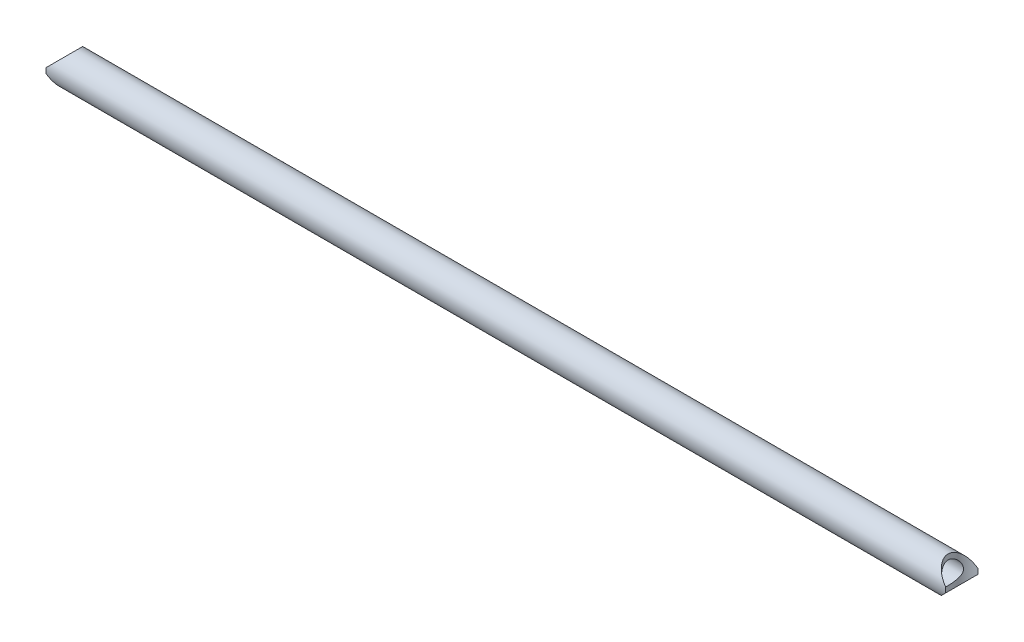
ISO-10303-21;
HEADER;
FILE_DESCRIPTION(('STEP AP214'),'2;1');
FILE_NAME('part.step','',(''),(''),'','','');
FILE_SCHEMA(('AUTOMOTIVE_DESIGN { 1 0 10303 214 1 1 1 1 }'));
ENDSEC;
DATA;
#1=APPLICATION_CONTEXT('core data for automotive mechanical design processes');
#2=APPLICATION_PROTOCOL_DEFINITION('international standard','automotive_design',2000,#1);
#3=PRODUCT_CONTEXT('',#1,'mechanical');
#4=PRODUCT('Part','Part','',(#3));
#5=PRODUCT_RELATED_PRODUCT_CATEGORY('part','',(#4));
#6=PRODUCT_DEFINITION_FORMATION('','',#4);
#7=PRODUCT_DEFINITION_CONTEXT('part definition',#1,'design');
#8=PRODUCT_DEFINITION('design','',#6,#7);
#9=PRODUCT_DEFINITION_SHAPE('','',#8);
#10=(LENGTH_UNIT() NAMED_UNIT(*) SI_UNIT(.MILLI.,.METRE.));
#11=(NAMED_UNIT(*) PLANE_ANGLE_UNIT() SI_UNIT($,.RADIAN.));
#12=(NAMED_UNIT(*) SI_UNIT($,.STERADIAN.) SOLID_ANGLE_UNIT());
#13=UNCERTAINTY_MEASURE_WITH_UNIT(LENGTH_MEASURE(1.E-05),#10,'distance_accuracy_value','');
#14=(GEOMETRIC_REPRESENTATION_CONTEXT(3) GLOBAL_UNCERTAINTY_ASSIGNED_CONTEXT((#13)) GLOBAL_UNIT_ASSIGNED_CONTEXT((#10,
#11,#12)) REPRESENTATION_CONTEXT('',''));
#15=CARTESIAN_POINT('',(0.,0.,0.));
#16=DIRECTION('',(0.,0.,1.));
#17=DIRECTION('',(1.,0.,0.));
#18=AXIS2_PLACEMENT_3D('',#15,#16,#17);
#19=CARTESIAN_POINT('',(261.9375,0.,0.));
#20=DIRECTION('',(1.,0.,0.));
#21=DIRECTION('',(0.,0.,-1.));
#22=AXIS2_PLACEMENT_3D('',#19,#20,#21);
#23=PLANE('',#22);
#24=CARTESIAN_POINT('',(261.9375,0.,0.));
#25=DIRECTION('',(1.,0.,0.));
#26=DIRECTION('',(0.,0.,-1.));
#27=AXIS2_PLACEMENT_3D('',#24,#25,#26);
#28=CIRCLE('',#27,9.525);
#29=CARTESIAN_POINT('',(261.9375,-1.58750000000008,9.39177665567063));
#30=VERTEX_POINT('',#29);
#31=CARTESIAN_POINT('',(261.9375,1.58750000000008,9.39177665567063));
#32=VERTEX_POINT('',#31);
#33=EDGE_CURVE('E68',#30,#32,#28,.F.);
#34=ORIENTED_EDGE('',*,*,#33,.F.);
#35=DIRECTION('',(0.,1.,0.));
#36=VECTOR('',#35,1.);
#37=CARTESIAN_POINT('',(261.9375,-65.5701,9.39177665567062));
#38=LINE('',#37,#36);
#39=EDGE_CURVE('E73',#30,#32,#38,.T.);
#40=ORIENTED_EDGE('',*,*,#39,.T.);
#41=EDGE_LOOP('',(#34,#40));
#42=FACE_BOUND('',#41,.T.);
#43=ADVANCED_FACE('F17',(#42),#23,.T.);
#44=CARTESIAN_POINT('',(-261.9375,0.,0.));
#45=DIRECTION('',(1.,0.,0.));
#46=DIRECTION('',(0.,0.,-1.));
#47=AXIS2_PLACEMENT_3D('',#44,#45,#46);
#48=PLANE('',#47);
#49=DIRECTION('',(0.,1.,0.));
#50=VECTOR('',#49,1.);
#51=CARTESIAN_POINT('',(-261.9375,-65.5701,9.39177665567062));
#52=LINE('',#51,#50);
#53=CARTESIAN_POINT('',(-261.9375,1.58750000000008,9.39177665567063));
#54=VERTEX_POINT('',#53);
#55=CARTESIAN_POINT('',(-261.9375,-1.58750000000008,9.39177665567063));
#56=VERTEX_POINT('',#55);
#57=EDGE_CURVE('E80',#54,#56,#52,.F.);
#58=ORIENTED_EDGE('',*,*,#57,.T.);
#59=CARTESIAN_POINT('',(-261.9375,0.,0.));
#60=DIRECTION('',(1.,0.,0.));
#61=DIRECTION('',(0.,0.,-1.));
#62=AXIS2_PLACEMENT_3D('',#59,#60,#61);
#63=CIRCLE('',#62,9.525);
#64=EDGE_CURVE('E78',#54,#56,#63,.T.);
#65=ORIENTED_EDGE('',*,*,#64,.F.);
#66=EDGE_LOOP('',(#58,#65));
#67=FACE_BOUND('',#66,.T.);
#68=ADVANCED_FACE('F112',(#67),#48,.F.);
#69=CARTESIAN_POINT('',(-261.9375,0.,0.));
#70=DIRECTION('',(1.,0.,0.));
#71=DIRECTION('',(0.,0.,-1.));
#72=AXIS2_PLACEMENT_3D('',#69,#70,#71);
#73=CYLINDRICAL_SURFACE('',#72,6.477);
#74=CARTESIAN_POINT('',(254.,6.477,0.));
#75=CARTESIAN_POINT('',(254.000000930985,6.47699902063564,0.161859991408693));
#76=CARTESIAN_POINT('',(254.004135231302,6.47092347500914,0.323737483139678));
#77=CARTESIAN_POINT('',(254.020574916608,6.44671059452453,0.646234711803029));
#78=CARTESIAN_POINT('',(254.032884245568,6.42856743774703,0.8068538037697));
#79=CARTESIAN_POINT('',(254.065399759226,6.38045887651486,1.12575090691301));
#80=CARTESIAN_POINT('',(254.085618070929,6.35047531625192,1.28402493369037));
#81=CARTESIAN_POINT('',(254.133481746217,6.2791097005026,1.59689476580041));
#82=CARTESIAN_POINT('',(254.161130319914,6.23772271817283,1.751488949823));
#83=CARTESIAN_POINT('',(254.22305061213,6.14437797195406,2.05504483319671));
#84=CARTESIAN_POINT('',(254.257282172855,6.09248420539763,2.20403444783158));
#85=CARTESIAN_POINT('',(254.331762405167,5.97857585926296,2.49656391181816));
#86=CARTESIAN_POINT('',(254.372013427471,5.91655732489571,2.64010160450528));
#87=CARTESIAN_POINT('',(254.500591205838,5.71632729768525,3.06131037303474));
#88=CARTESIAN_POINT('',(254.596819310904,5.56382831896324,3.32993886835331));
#89=CARTESIAN_POINT('',(254.81249853693,5.21102308701011,3.86098804990281));
#90=CARTESIAN_POINT('',(254.933238193239,5.00772336343044,4.12086383877964));
#91=CARTESIAN_POINT('',(255.18289428714,4.56617268089548,4.60533984344896));
#92=CARTESIAN_POINT('',(255.311822950961,4.32786872952861,4.82988548670451));
#93=CARTESIAN_POINT('',(255.514359640412,3.92587947637853,5.15511939740142));
#94=CARTESIAN_POINT('',(255.588614917699,3.77252181201225,5.26840752743897));
#95=CARTESIAN_POINT('',(255.734357583297,3.45541080784627,5.48162066039673));
#96=CARTESIAN_POINT('',(255.805844303871,3.29165498498653,5.58154245362992));
#97=CARTESIAN_POINT('',(255.94347969795,2.95448799020851,5.76710565973809));
#98=CARTESIAN_POINT('',(256.009636821888,2.78109287058018,5.85276991837298));
#99=CARTESIAN_POINT('',(256.134044325292,2.42486119568457,6.00910844296647));
#100=CARTESIAN_POINT('',(256.192294566262,2.2420244751174,6.07978244637075));
#101=CARTESIAN_POINT('',(256.282157002277,1.92367949535164,6.18628784096023));
#102=CARTESIAN_POINT('',(256.316533221787,1.79031358505837,6.22622506177775));
#103=CARTESIAN_POINT('',(256.378889490245,1.51989866178686,6.29769648410806));
#104=CARTESIAN_POINT('',(256.406871359268,1.38285070930112,6.32923307718305));
#105=CARTESIAN_POINT('',(256.455443769552,1.10592771933486,6.38344162112075));
#106=CARTESIAN_POINT('',(256.476045263158,0.966057199085904,6.40612671195239));
#107=CARTESIAN_POINT('',(256.509118039644,0.684169243413167,6.44233112113181));
#108=CARTESIAN_POINT('',(256.521589300497,0.542151802173904,6.45585041464713));
#109=CARTESIAN_POINT('',(256.537914386746,0.256348970234714,6.47351588669589));
#110=CARTESIAN_POINT('',(256.54172667664,0.112558370833687,6.47761688844381));
#111=CARTESIAN_POINT('',(256.540443326849,-0.174934617387526,6.47623293328364));
#112=CARTESIAN_POINT('',(256.53534768356,-0.31863700617201,6.4707479724982));
#113=CARTESIAN_POINT('',(256.516464476622,-0.604877368980771,6.45029057713175));
#114=CARTESIAN_POINT('',(256.502671475677,-0.747414558054176,6.43531220756058));
#115=CARTESIAN_POINT('',(256.466982809079,-1.03015441555672,6.39614774621474));
#116=CARTESIAN_POINT('',(256.445086958341,-1.1703570305834,6.37196144411342));
#117=CARTESIAN_POINT('',(256.371164311498,-1.57151737734537,6.28916546635215));
#118=CARTESIAN_POINT('',(256.309694156112,-1.82846527571213,6.21910574963729));
#119=CARTESIAN_POINT('',(256.167568010104,-2.32704967278986,6.05027939563835));
#120=CARTESIAN_POINT('',(256.086897159026,-2.56867412750301,5.95149051009416));
#121=CARTESIAN_POINT('',(255.935515243724,-2.97524781039388,5.75642971591143));
#122=CARTESIAN_POINT('',(255.867509123286,-3.14403898346141,5.66593829377765));
#123=CARTESIAN_POINT('',(255.727229382188,-3.47175453459498,5.4712692616532));
#124=CARTESIAN_POINT('',(255.654954186027,-3.63067522500948,5.36708658131106));
#125=CARTESIAN_POINT('',(255.50833002243,-3.93843005090919,5.1455135452992));
#126=CARTESIAN_POINT('',(255.433977893223,-4.0872474755389,5.02810212298999));
#127=CARTESIAN_POINT('',(255.285377528438,-4.3740507902878,4.78069737839078));
#128=CARTESIAN_POINT('',(255.211129281547,-4.51203796771266,4.65070555554735));
#129=CARTESIAN_POINT('',(255.063996934869,-4.77774175502738,4.37736795593038));
#130=CARTESIAN_POINT('',(254.991130084736,-4.90535970524678,4.23391683747299));
#131=CARTESIAN_POINT('',(254.849266004001,-5.14820099638155,3.93505085849181));
#132=CARTESIAN_POINT('',(254.780269142433,-5.26342315621797,3.77963486036261));
#133=CARTESIAN_POINT('',(254.648033224316,-5.48031192519516,3.45764864801706));
#134=CARTESIAN_POINT('',(254.584786159453,-5.58199748275941,3.29109452645897));
#135=CARTESIAN_POINT('',(254.465685309582,-5.77082786323257,2.94745279497763));
#136=CARTESIAN_POINT('',(254.409829072914,-5.85797751045142,2.77036870641006));
#137=CARTESIAN_POINT('',(254.318505682014,-5.99897047854085,2.44698855291382));
#138=CARTESIAN_POINT('',(254.281260855192,-6.05591773029683,2.30253994989057));
#139=CARTESIAN_POINT('',(254.212975232972,-6.15964571764519,2.00862296214991));
#140=CARTESIAN_POINT('',(254.181933197538,-6.20642848544049,1.85915558775622));
#141=CARTESIAN_POINT('',(254.126753495121,-6.2891883656325,1.55634958893369));
#142=CARTESIAN_POINT('',(254.102601652386,-6.32518767146094,1.40301962952517));
#143=CARTESIAN_POINT('',(254.061658893947,-6.38601882950279,1.09324664274341));
#144=CARTESIAN_POINT('',(254.044864737208,-6.41085559889845,0.936805017859331));
#145=CARTESIAN_POINT('',(254.021349337593,-6.44557282711493,0.650388584800402));
#146=CARTESIAN_POINT('',(254.013355732223,-6.45734574240924,0.520743628143372));
#147=CARTESIAN_POINT('',(254.002680174885,-6.47306048049024,0.260736321547777));
#148=CARTESIAN_POINT('',(253.999999250117,-6.47700078885146,0.130373837761215));
#149=CARTESIAN_POINT('',(254.000000930985,-6.47699902063564,-0.161859991408698));
#150=CARTESIAN_POINT('',(254.004135231302,-6.47092347500914,-0.323737483139683));
#151=CARTESIAN_POINT('',(254.020574916608,-6.44671059452453,-0.646234711803033));
#152=CARTESIAN_POINT('',(254.032884245568,-6.42856743774703,-0.806853803769703));
#153=CARTESIAN_POINT('',(254.065399759226,-6.38045887651486,-1.12575090691301));
#154=CARTESIAN_POINT('',(254.085618070929,-6.35047531625192,-1.28402493369037));
#155=CARTESIAN_POINT('',(254.133481746217,-6.2791097005026,-1.59689476580041));
#156=CARTESIAN_POINT('',(254.161130319914,-6.23772271817283,-1.751488949823));
#157=CARTESIAN_POINT('',(254.22305061213,-6.14437797195406,-2.05504483319672));
#158=CARTESIAN_POINT('',(254.257282172855,-6.09248420539763,-2.20403444783158));
#159=CARTESIAN_POINT('',(254.331762405167,-5.97857585926296,-2.49656391181816));
#160=CARTESIAN_POINT('',(254.372013427471,-5.91655732489571,-2.64010160450528));
#161=CARTESIAN_POINT('',(254.500591205838,-5.71632729768525,-3.06131037303474));
#162=CARTESIAN_POINT('',(254.596819310904,-5.56382831896324,-3.32993886835331));
#163=CARTESIAN_POINT('',(254.81249853693,-5.21102308701011,-3.86098804990281));
#164=CARTESIAN_POINT('',(254.933238193239,-5.00772336343044,-4.12086383877964));
#165=CARTESIAN_POINT('',(255.18289428714,-4.56617268089548,-4.60533984344896));
#166=CARTESIAN_POINT('',(255.311822950961,-4.32786872952861,-4.82988548670452));
#167=CARTESIAN_POINT('',(255.514359640412,-3.92587947637853,-5.15511939740142));
#168=CARTESIAN_POINT('',(255.588614917699,-3.77252181201226,-5.26840752743897));
#169=CARTESIAN_POINT('',(255.734357583297,-3.45541080784628,-5.48162066039673));
#170=CARTESIAN_POINT('',(255.805844303871,-3.29165498498653,-5.58154245362992));
#171=CARTESIAN_POINT('',(255.94347969795,-2.95448799020851,-5.76710565973809));
#172=CARTESIAN_POINT('',(256.009636821888,-2.78109287058017,-5.85276991837298));
#173=CARTESIAN_POINT('',(256.134044325292,-2.42486119568456,-6.00910844296647));
#174=CARTESIAN_POINT('',(256.192294566262,-2.24202447511739,-6.07978244637075));
#175=CARTESIAN_POINT('',(256.282157002277,-1.92367949535163,-6.18628784096023));
#176=CARTESIAN_POINT('',(256.316533221787,-1.79031358505836,-6.22622506177775));
#177=CARTESIAN_POINT('',(256.378889490245,-1.51989866178684,-6.29769648410807));
#178=CARTESIAN_POINT('',(256.406871359268,-1.38285070930109,-6.32923307718305));
#179=CARTESIAN_POINT('',(256.455443769552,-1.10592771933484,-6.38344162112075));
#180=CARTESIAN_POINT('',(256.476045263158,-0.966057199085884,-6.40612671195239));
#181=CARTESIAN_POINT('',(256.509118039644,-0.684169243413151,-6.44233112113181));
#182=CARTESIAN_POINT('',(256.521589300497,-0.54215180217389,-6.45585041464713));
#183=CARTESIAN_POINT('',(256.537914386746,-0.2563489702347,-6.47351588669589));
#184=CARTESIAN_POINT('',(256.54172667664,-0.112558370833673,-6.47761688844381));
#185=CARTESIAN_POINT('',(256.540443326849,0.174934617387542,-6.47623293328364));
#186=CARTESIAN_POINT('',(256.53534768356,0.318637006172027,-6.4707479724982));
#187=CARTESIAN_POINT('',(256.516464476622,0.604877368980791,-6.45029057713175));
#188=CARTESIAN_POINT('',(256.502671475677,0.747414558054199,-6.43531220756058));
#189=CARTESIAN_POINT('',(256.466982809079,1.03015441555674,-6.39614774621473));
#190=CARTESIAN_POINT('',(256.445086958341,1.17035703058342,-6.37196144411342));
#191=CARTESIAN_POINT('',(256.371164311498,1.57151737734539,-6.28916546635215));
#192=CARTESIAN_POINT('',(256.309694156112,1.82846527571214,-6.21910574963729));
#193=CARTESIAN_POINT('',(256.167568010104,2.32704967278988,-6.05027939563834));
#194=CARTESIAN_POINT('',(256.086897159026,2.56867412750304,-5.95149051009415));
#195=CARTESIAN_POINT('',(255.935515243724,2.9752478103939,-5.75642971591141));
#196=CARTESIAN_POINT('',(255.867509123286,3.14403898346143,-5.66593829377764));
#197=CARTESIAN_POINT('',(255.727229382188,3.47175453459499,-5.47126926165319));
#198=CARTESIAN_POINT('',(255.654954186027,3.63067522500949,-5.36708658131105));
#199=CARTESIAN_POINT('',(255.50833002243,3.93843005090921,-5.14551354529918));
#200=CARTESIAN_POINT('',(255.433977893223,4.08724747553893,-5.02810212298996));
#201=CARTESIAN_POINT('',(255.285377528438,4.37405079028783,-4.78069737839075));
#202=CARTESIAN_POINT('',(255.211129281547,4.51203796771268,-4.65070555554733));
#203=CARTESIAN_POINT('',(255.063996934869,4.77774175502741,-4.37736795593035));
#204=CARTESIAN_POINT('',(254.991130084736,4.90535970524681,-4.23391683747295));
#205=CARTESIAN_POINT('',(254.849266004001,5.14820099638158,-3.93505085849176));
#206=CARTESIAN_POINT('',(254.780269142432,5.26342315621799,-3.77963486036258));
#207=CARTESIAN_POINT('',(254.648033224316,5.48031192519518,-3.45764864801702));
#208=CARTESIAN_POINT('',(254.584786159453,5.58199748275944,-3.29109452645892));
#209=CARTESIAN_POINT('',(254.465685309582,5.7708278632326,-2.94745279497757));
#210=CARTESIAN_POINT('',(254.409829072914,5.85797751045145,-2.77036870641001));
#211=CARTESIAN_POINT('',(254.318505682014,5.99897047854087,-2.44698855291376));
#212=CARTESIAN_POINT('',(254.281260855192,6.05591773029686,-2.3025399498905));
#213=CARTESIAN_POINT('',(254.212975232972,6.15964571764521,-2.00862296214983));
#214=CARTESIAN_POINT('',(254.181933197538,6.20642848544051,-1.85915558775615));
#215=CARTESIAN_POINT('',(254.126753495121,6.28918836563252,-1.55634958893362));
#216=CARTESIAN_POINT('',(254.102601652386,6.32518767146096,-1.40301962952511));
#217=CARTESIAN_POINT('',(254.061658893947,6.3860188295028,-1.09324664274335));
#218=CARTESIAN_POINT('',(254.044864737208,6.41085559889846,-0.936805017859272));
#219=CARTESIAN_POINT('',(254.021349337593,6.44557282711494,-0.650388584800354));
#220=CARTESIAN_POINT('',(254.013355732223,6.45734574240924,-0.520743628143333));
#221=CARTESIAN_POINT('',(254.002680174885,6.47306048049024,-0.260736321547759));
#222=CARTESIAN_POINT('',(253.999999250117,6.47700078885146,-0.130373837761209));
#223=CARTESIAN_POINT('',(254.,6.477,0.));
#224=B_SPLINE_CURVE_WITH_KNOTS('',3,(#74,#75,#76,#77,#78,#79,#80,#81,#82,#83,#84,#85,#86,#87,
#88,#89,#90,#91,#92,#93,#94,#95,#96,#97,#98,#99,#100,#101,#102,#103,#104,#105,#106,#107,#108,
#109,#110,#111,#112,#113,#114,#115,#116,#117,#118,#119,#120,#121,#122,#123,#124,#125,#126,#127,
#128,#129,#130,#131,#132,#133,#134,#135,#136,#137,#138,#139,#140,#141,#142,#143,#144,#145,#146,
#147,#148,#149,#150,#151,#152,#153,#154,#155,#156,#157,#158,#159,#160,#161,#162,#163,#164,#165,
#166,#167,#168,#169,#170,#171,#172,#173,#174,#175,#176,#177,#178,#179,#180,#181,#182,#183,#184,
#185,#186,#187,#188,#189,#190,#191,#192,#193,#194,#195,#196,#197,#198,#199,#200,#201,#202,#203,
#204,#205,#206,#207,#208,#209,#210,#211,#212,#213,#214,#215,#216,#217,#218,#219,#220,#221,#222,
#223),.UNSPECIFIED.,.T.,.F.,(4,2,2,2,2,2,2,2,2,2,2,2,2,2,2,2,2,2,2,2,2,2,2,2,2,2,2,2,2,2,2,2,2,
2,2,2,2,2,2,2,2,2,2,2,2,2,2,2,2,2,2,2,2,2,2,2,2,2,2,2,2,2,2,2,2,2,2,2,2,2,2,2,2,2,4),(0.,
0.485445035240249,0.971124439466942,1.45755148350197,1.94418901856093,2.4279470743141,
2.9118945426819,3.87864232463296,4.92897664541366,5.98091776126256,6.59415554899405,
7.20754033148497,7.81993258303055,8.4323355597404,8.86214713662765,9.29183622000592,
9.72088498500894,10.1499349124087,10.5810386062942,11.0121424745532,11.4435161220252,
11.8748996234808,12.6916407028376,13.509015969617,14.1179849928111,14.7271801774201,
15.3373595897461,15.9474663646979,16.5628261978056,17.1782446109664,17.7927922991829,
18.4071356181224,18.8856747696512,19.3641181577961,19.8415699875788,20.3188112895576,
20.709748533231,21.1007613568176,21.5862063920578,22.0718857962845,22.5583128403195,
23.0449503753785,23.5287084311317,24.0126558994995,24.9794036814505,26.0297380022312,
27.0816791180801,27.6949169058116,28.3083016883025,28.9206939398481,29.5330969165579,
29.9629084934452,30.3925975768235,30.8216463418265,31.2506962692262,31.6817999631117,
32.1129038313707,32.5442774788427,32.9756609802984,33.7924020596551,34.6097773264346,
35.2187463496286,35.8279415342376,36.4381209465637,37.0482277215155,37.6635875546232,
38.279005967784,38.8935536560004,39.5078969749401,39.9864361264689,40.4648795146137,
40.9423313443964,41.4195726463752,41.8105098900486,42.2015227136351),.UNSPECIFIED.);
#225=CARTESIAN_POINT('',(254.,6.477,0.));
#226=VERTEX_POINT('',#225);
#227=EDGE_CURVE('E20',#226,#226,#224,.T.);
#228=ORIENTED_EDGE('',*,*,#227,.T.);
#229=EDGE_LOOP('',(#228));
#230=FACE_BOUND('',#229,.T.);
#231=CARTESIAN_POINT('',(-254.,-6.477,0.));
#232=CARTESIAN_POINT('',(-254.000000930985,-6.47699902063564,0.161859991408695));
#233=CARTESIAN_POINT('',(-254.004135231302,-6.47092347500914,0.32373748313968));
#234=CARTESIAN_POINT('',(-254.020574916608,-6.44671059452453,0.64623471180303));
#235=CARTESIAN_POINT('',(-254.032884245568,-6.42856743774703,0.806853803769702));
#236=CARTESIAN_POINT('',(-254.065399759226,-6.38045887651486,1.12575090691301));
#237=CARTESIAN_POINT('',(-254.085618070929,-6.35047531625192,1.28402493369037));
#238=CARTESIAN_POINT('',(-254.133481746217,-6.2791097005026,1.59689476580041));
#239=CARTESIAN_POINT('',(-254.161130319914,-6.23772271817283,1.751488949823));
#240=CARTESIAN_POINT('',(-254.22305061213,-6.14437797195406,2.05504483319672));
#241=CARTESIAN_POINT('',(-254.257282172855,-6.09248420539763,2.20403444783158));
#242=CARTESIAN_POINT('',(-254.331762405167,-5.97857585926296,2.49656391181816));
#243=CARTESIAN_POINT('',(-254.372013427471,-5.91655732489571,2.64010160450528));
#244=CARTESIAN_POINT('',(-254.500591205838,-5.71632729768525,3.06131037303474));
#245=CARTESIAN_POINT('',(-254.596819310904,-5.56382831896324,3.32993886835331));
#246=CARTESIAN_POINT('',(-254.81249853693,-5.21102308701011,3.86098804990281));
#247=CARTESIAN_POINT('',(-254.933238193239,-5.00772336343044,4.12086383877964));
#248=CARTESIAN_POINT('',(-255.18289428714,-4.56617268089548,4.60533984344896));
#249=CARTESIAN_POINT('',(-255.311822950961,-4.32786872952861,4.82988548670452));
#250=CARTESIAN_POINT('',(-255.514359640412,-3.92587947637853,5.15511939740142));
#251=CARTESIAN_POINT('',(-255.588614917699,-3.77252181201224,5.26840752743897));
#252=CARTESIAN_POINT('',(-255.734357583297,-3.45541080784627,5.48162066039673));
#253=CARTESIAN_POINT('',(-255.805844303871,-3.29165498498653,5.58154245362992));
#254=CARTESIAN_POINT('',(-255.94347969795,-2.95448799020851,5.76710565973809));
#255=CARTESIAN_POINT('',(-256.009636821888,-2.78109287058017,5.85276991837298));
#256=CARTESIAN_POINT('',(-256.134044325292,-2.42486119568456,6.00910844296647));
#257=CARTESIAN_POINT('',(-256.192294566262,-2.24202447511739,6.07978244637075));
#258=CARTESIAN_POINT('',(-256.282157002277,-1.92367949535164,6.18628784096023));
#259=CARTESIAN_POINT('',(-256.316533221787,-1.79031358505837,6.22622506177775));
#260=CARTESIAN_POINT('',(-256.378889490245,-1.51989866178685,6.29769648410806));
#261=CARTESIAN_POINT('',(-256.406871359268,-1.38285070930111,6.32923307718305));
#262=CARTESIAN_POINT('',(-256.455443769552,-1.10592771933486,6.38344162112075));
#263=CARTESIAN_POINT('',(-256.476045263158,-0.966057199085896,6.40612671195239));
#264=CARTESIAN_POINT('',(-256.509118039644,-0.684169243413157,6.44233112113181));
#265=CARTESIAN_POINT('',(-256.521589300497,-0.542151802173892,6.45585041464713));
#266=CARTESIAN_POINT('',(-256.537914386746,-0.2563489702347,6.47351588669589));
#267=CARTESIAN_POINT('',(-256.54172667664,-0.112558370833672,6.47761688844381));
#268=CARTESIAN_POINT('',(-256.540443326849,0.174934617387542,6.47623293328364));
#269=CARTESIAN_POINT('',(-256.53534768356,0.318637006172026,6.4707479724982));
#270=CARTESIAN_POINT('',(-256.516464476622,0.604877368980791,6.45029057713175));
#271=CARTESIAN_POINT('',(-256.502671475677,0.7474145580542,6.43531220756058));
#272=CARTESIAN_POINT('',(-256.466982809079,1.03015441555675,6.39614774621473));
#273=CARTESIAN_POINT('',(-256.445086958341,1.17035703058342,6.37196144411342));
#274=CARTESIAN_POINT('',(-256.371164311498,1.57151737734539,6.28916546635214));
#275=CARTESIAN_POINT('',(-256.309694156112,1.82846527571215,6.21910574963729));
#276=CARTESIAN_POINT('',(-256.167568010104,2.32704967278988,6.05027939563834));
#277=CARTESIAN_POINT('',(-256.086897159026,2.56867412750303,5.95149051009415));
#278=CARTESIAN_POINT('',(-255.935515243724,2.9752478103939,5.75642971591141));
#279=CARTESIAN_POINT('',(-255.867509123286,3.14403898346144,5.66593829377763));
#280=CARTESIAN_POINT('',(-255.727229382188,3.471754534595,5.47126926165319));
#281=CARTESIAN_POINT('',(-255.654954186027,3.63067522500949,5.36708658131106));
#282=CARTESIAN_POINT('',(-255.50833002243,3.9384300509092,5.14551354529919));
#283=CARTESIAN_POINT('',(-255.433977893223,4.08724747553893,5.02810212298997));
#284=CARTESIAN_POINT('',(-255.285377528438,4.37405079028784,4.78069737839075));
#285=CARTESIAN_POINT('',(-255.211129281547,4.51203796771268,4.65070555554733));
#286=CARTESIAN_POINT('',(-255.063996934869,4.77774175502741,4.37736795593035));
#287=CARTESIAN_POINT('',(-254.991130084736,4.90535970524683,4.23391683747293));
#288=CARTESIAN_POINT('',(-254.849266004001,5.14820099638159,3.93505085849175));
#289=CARTESIAN_POINT('',(-254.780269142432,5.26342315621799,3.77963486036257));
#290=CARTESIAN_POINT('',(-254.648033224316,5.48031192519518,3.45764864801703));
#291=CARTESIAN_POINT('',(-254.584786159453,5.58199748275944,3.29109452645893));
#292=CARTESIAN_POINT('',(-254.465685309582,5.7708278632326,2.94745279497757));
#293=CARTESIAN_POINT('',(-254.409829072914,5.85797751045145,2.77036870641001));
#294=CARTESIAN_POINT('',(-254.318505682014,5.99897047854087,2.44698855291376));
#295=CARTESIAN_POINT('',(-254.281260855192,6.05591773029686,2.30253994989051));
#296=CARTESIAN_POINT('',(-254.212975232972,6.15964571764521,2.00862296214984));
#297=CARTESIAN_POINT('',(-254.181933197538,6.20642848544051,1.85915558775616));
#298=CARTESIAN_POINT('',(-254.126753495121,6.28918836563252,1.55634958893364));
#299=CARTESIAN_POINT('',(-254.102601652386,6.32518767146095,1.40301962952511));
#300=CARTESIAN_POINT('',(-254.061658893947,6.3860188295028,1.09324664274335));
#301=CARTESIAN_POINT('',(-254.044864737208,6.41085559889845,0.936805017859277));
#302=CARTESIAN_POINT('',(-254.021349337593,6.44557282711493,0.650388584800357));
#303=CARTESIAN_POINT('',(-254.013355732223,6.45734574240924,0.520743628143334));
#304=CARTESIAN_POINT('',(-254.002680174885,6.47306048049024,0.260736321547756));
#305=CARTESIAN_POINT('',(-253.999999250117,6.47700078885146,0.130373837761205));
#306=CARTESIAN_POINT('',(-254.000000930985,6.47699902063564,-0.161859991408699));
#307=CARTESIAN_POINT('',(-254.004135231302,6.47092347500914,-0.323737483139685));
#308=CARTESIAN_POINT('',(-254.020574916608,6.44671059452453,-0.646234711803035));
#309=CARTESIAN_POINT('',(-254.032884245568,6.42856743774703,-0.806853803769706));
#310=CARTESIAN_POINT('',(-254.065399759226,6.38045887651486,-1.12575090691301));
#311=CARTESIAN_POINT('',(-254.085618070929,6.35047531625192,-1.28402493369037));
#312=CARTESIAN_POINT('',(-254.133481746217,6.2791097005026,-1.59689476580041));
#313=CARTESIAN_POINT('',(-254.161130319914,6.23772271817282,-1.751488949823));
#314=CARTESIAN_POINT('',(-254.22305061213,6.14437797195406,-2.05504483319672));
#315=CARTESIAN_POINT('',(-254.257282172855,6.09248420539763,-2.20403444783158));
#316=CARTESIAN_POINT('',(-254.331762405167,5.97857585926296,-2.49656391181816));
#317=CARTESIAN_POINT('',(-254.372013427471,5.91655732489571,-2.64010160450528));
#318=CARTESIAN_POINT('',(-254.500591205838,5.71632729768525,-3.06131037303474));
#319=CARTESIAN_POINT('',(-254.596819310904,5.56382831896324,-3.32993886835331));
#320=CARTESIAN_POINT('',(-254.81249853693,5.21102308701011,-3.86098804990281));
#321=CARTESIAN_POINT('',(-254.933238193239,5.00772336343044,-4.12086383877964));
#322=CARTESIAN_POINT('',(-255.18289428714,4.56617268089548,-4.60533984344896));
#323=CARTESIAN_POINT('',(-255.311822950961,4.3278687295286,-4.82988548670452));
#324=CARTESIAN_POINT('',(-255.514359640412,3.92587947637853,-5.15511939740142));
#325=CARTESIAN_POINT('',(-255.588614917699,3.77252181201226,-5.26840752743896));
#326=CARTESIAN_POINT('',(-255.734357583297,3.45541080784629,-5.48162066039672));
#327=CARTESIAN_POINT('',(-255.805844303871,3.29165498498655,-5.58154245362991));
#328=CARTESIAN_POINT('',(-255.94347969795,2.95448799020853,-5.76710565973808));
#329=CARTESIAN_POINT('',(-256.009636821888,2.78109287058019,-5.85276991837297));
#330=CARTESIAN_POINT('',(-256.134044325292,2.42486119568457,-6.00910844296646));
#331=CARTESIAN_POINT('',(-256.192294566262,2.2420244751174,-6.07978244637075));
#332=CARTESIAN_POINT('',(-256.282157002277,1.92367949535163,-6.18628784096023));
#333=CARTESIAN_POINT('',(-256.316533221787,1.79031358505836,-6.22622506177775));
#334=CARTESIAN_POINT('',(-256.378889490245,1.51989866178684,-6.29769648410807));
#335=CARTESIAN_POINT('',(-256.406871359268,1.38285070930109,-6.32923307718305));
#336=CARTESIAN_POINT('',(-256.455443769552,1.10592771933484,-6.38344162112075));
#337=CARTESIAN_POINT('',(-256.476045263158,0.966057199085884,-6.40612671195239));
#338=CARTESIAN_POINT('',(-256.509118039644,0.684169243413151,-6.44233112113181));
#339=CARTESIAN_POINT('',(-256.521589300497,0.54215180217389,-6.45585041464713));
#340=CARTESIAN_POINT('',(-256.537914386746,0.256348970234701,-6.47351588669589));
#341=CARTESIAN_POINT('',(-256.54172667664,0.112558370833674,-6.47761688844381));
#342=CARTESIAN_POINT('',(-256.540443326849,-0.174934617387541,-6.47623293328364));
#343=CARTESIAN_POINT('',(-256.53534768356,-0.318637006172025,-6.4707479724982));
#344=CARTESIAN_POINT('',(-256.516464476622,-0.604877368980791,-6.45029057713175));
#345=CARTESIAN_POINT('',(-256.502671475677,-0.7474145580542,-6.43531220756058));
#346=CARTESIAN_POINT('',(-256.466982809079,-1.03015441555674,-6.39614774621473));
#347=CARTESIAN_POINT('',(-256.445086958341,-1.17035703058342,-6.37196144411342));
#348=CARTESIAN_POINT('',(-256.371164311498,-1.57151737734539,-6.28916546635215));
#349=CARTESIAN_POINT('',(-256.309694156112,-1.82846527571214,-6.21910574963729));
#350=CARTESIAN_POINT('',(-256.167568010104,-2.32704967278988,-6.05027939563834));
#351=CARTESIAN_POINT('',(-256.086897159026,-2.56867412750304,-5.95149051009415));
#352=CARTESIAN_POINT('',(-255.935515243724,-2.9752478103939,-5.75642971591141));
#353=CARTESIAN_POINT('',(-255.867509123286,-3.14403898346143,-5.66593829377763));
#354=CARTESIAN_POINT('',(-255.727229382188,-3.471754534595,-5.47126926165319));
#355=CARTESIAN_POINT('',(-255.654954186027,-3.63067522500949,-5.36708658131105));
#356=CARTESIAN_POINT('',(-255.50833002243,-3.93843005090921,-5.14551354529918));
#357=CARTESIAN_POINT('',(-255.433977893223,-4.08724747553893,-5.02810212298996));
#358=CARTESIAN_POINT('',(-255.285377528438,-4.37405079028783,-4.78069737839075));
#359=CARTESIAN_POINT('',(-255.211129281547,-4.51203796771268,-4.65070555554733));
#360=CARTESIAN_POINT('',(-255.063996934869,-4.77774175502741,-4.37736795593035));
#361=CARTESIAN_POINT('',(-254.991130084736,-4.90535970524681,-4.23391683747295));
#362=CARTESIAN_POINT('',(-254.849266004001,-5.14820099638158,-3.93505085849176));
#363=CARTESIAN_POINT('',(-254.780269142432,-5.26342315621799,-3.77963486036258));
#364=CARTESIAN_POINT('',(-254.648033224316,-5.48031192519518,-3.45764864801702));
#365=CARTESIAN_POINT('',(-254.584786159453,-5.58199748275944,-3.29109452645892));
#366=CARTESIAN_POINT('',(-254.465685309582,-5.7708278632326,-2.94745279497757));
#367=CARTESIAN_POINT('',(-254.409829072914,-5.85797751045145,-2.77036870641001));
#368=CARTESIAN_POINT('',(-254.318505682014,-5.99897047854087,-2.44698855291376));
#369=CARTESIAN_POINT('',(-254.281260855192,-6.05591773029686,-2.3025399498905));
#370=CARTESIAN_POINT('',(-254.212975232972,-6.15964571764521,-2.00862296214983));
#371=CARTESIAN_POINT('',(-254.181933197538,-6.20642848544051,-1.85915558775615));
#372=CARTESIAN_POINT('',(-254.126753495121,-6.28918836563252,-1.55634958893362));
#373=CARTESIAN_POINT('',(-254.102601652386,-6.32518767146096,-1.4030196295251));
#374=CARTESIAN_POINT('',(-254.061658893947,-6.3860188295028,-1.09324664274335));
#375=CARTESIAN_POINT('',(-254.044864737208,-6.41085559889846,-0.93680501785927));
#376=CARTESIAN_POINT('',(-254.021349337593,-6.44557282711494,-0.650388584800354));
#377=CARTESIAN_POINT('',(-254.013355732223,-6.45734574240924,-0.520743628143333));
#378=CARTESIAN_POINT('',(-254.002680174885,-6.47306048049024,-0.260736321547758));
#379=CARTESIAN_POINT('',(-253.999999250117,-6.47700078885146,-0.130373837761208));
#380=CARTESIAN_POINT('',(-254.,-6.477,0.));
#381=B_SPLINE_CURVE_WITH_KNOTS('',3,(#231,#232,#233,#234,#235,#236,#237,#238,#239,#240,#241,
#242,#243,#244,#245,#246,#247,#248,#249,#250,#251,#252,#253,#254,#255,#256,#257,#258,#259,#260,
#261,#262,#263,#264,#265,#266,#267,#268,#269,#270,#271,#272,#273,#274,#275,#276,#277,#278,#279,
#280,#281,#282,#283,#284,#285,#286,#287,#288,#289,#290,#291,#292,#293,#294,#295,#296,#297,#298,
#299,#300,#301,#302,#303,#304,#305,#306,#307,#308,#309,#310,#311,#312,#313,#314,#315,#316,#317,
#318,#319,#320,#321,#322,#323,#324,#325,#326,#327,#328,#329,#330,#331,#332,#333,#334,#335,#336,
#337,#338,#339,#340,#341,#342,#343,#344,#345,#346,#347,#348,#349,#350,#351,#352,#353,#354,#355,
#356,#357,#358,#359,#360,#361,#362,#363,#364,#365,#366,#367,#368,#369,#370,#371,#372,#373,#374,
#375,#376,#377,#378,#379,#380),.UNSPECIFIED.,.T.,.F.,(4,2,2,2,2,2,2,2,2,2,2,2,2,2,2,2,2,2,2,2,2,
2,2,2,2,2,2,2,2,2,2,2,2,2,2,2,2,2,2,2,2,2,2,2,2,2,2,2,2,2,2,2,2,2,2,2,2,2,2,2,2,2,2,2,2,2,2,2,2,
2,2,2,2,2,4),(0.,0.485445035240249,0.971124439466942,1.45755148350197,1.94418901856093,
2.4279470743141,2.9118945426819,3.87864232463296,4.92897664541366,5.98091776126256,
6.59415554899405,7.20754033148497,7.81993258303055,8.4323355597404,8.86214713662765,
9.29183622000592,9.72088498500895,10.1499349124087,10.5810386062942,11.0121424745532,
11.4435161220252,11.8748996234808,12.6916407028376,13.509015969617,14.1179849928111,
14.7271801774201,15.3373595897462,15.9474663646979,16.5628261978057,17.1782446109664,
17.7927922991829,18.4071356181225,18.8856747696513,19.3641181577961,19.8415699875788,
20.3188112895577,20.7097485332311,21.1007613568175,21.5862063920578,22.0718857962845,
22.5583128403195,23.0449503753785,23.5287084311316,24.0126558994994,24.9794036814505,
26.0297380022312,27.0816791180801,27.6949169058116,28.3083016883025,28.9206939398481,
29.5330969165579,29.9629084934452,30.3925975768235,30.8216463418265,31.2506962692262,
31.6817999631117,32.1129038313707,32.5442774788427,32.9756609802984,33.7924020596551,
34.6097773264345,35.2187463496286,35.8279415342376,36.4381209465637,37.0482277215155,
37.6635875546232,38.279005967784,38.8935536560004,39.5078969749401,39.9864361264689,
40.4648795146137,40.9423313443964,41.4195726463752,41.8105098900486,42.2015227136351),.UNSPECIFIED.);
#382=CARTESIAN_POINT('',(-254.,-6.477,0.));
#383=VERTEX_POINT('',#382);
#384=EDGE_CURVE('E84',#383,#383,#381,.T.);
#385=ORIENTED_EDGE('',*,*,#384,.T.);
#386=EDGE_LOOP('',(#385));
#387=FACE_BOUND('',#386,.T.);
#388=ADVANCED_FACE('F91',(#230,#387),#73,.F.);
#389=CARTESIAN_POINT('',(261.9375,0.,0.));
#390=DIRECTION('',(1.,0.,0.));
#391=DIRECTION('',(0.,0.,-1.));
#392=AXIS2_PLACEMENT_3D('',#389,#390,#391);
#393=PLANE('',#392);
#394=CARTESIAN_POINT('',(261.9375,0.,0.));
#395=DIRECTION('',(1.,0.,0.));
#396=DIRECTION('',(0.,0.,-1.));
#397=AXIS2_PLACEMENT_3D('',#394,#395,#396);
#398=CIRCLE('',#397,9.525);
#399=CARTESIAN_POINT('',(261.9375,1.58750000000008,-9.39177665567063));
#400=VERTEX_POINT('',#399);
#401=CARTESIAN_POINT('',(261.9375,-1.58750000000008,-9.39177665567063));
#402=VERTEX_POINT('',#401);
#403=EDGE_CURVE('E70',#400,#402,#398,.F.);
#404=ORIENTED_EDGE('',*,*,#403,.F.);
#405=DIRECTION('',(0.,1.,0.));
#406=VECTOR('',#405,1.);
#407=CARTESIAN_POINT('',(261.9375,-65.5701,-9.39177665567062));
#408=LINE('',#407,#406);
#409=EDGE_CURVE('E76',#400,#402,#408,.F.);
#410=ORIENTED_EDGE('',*,*,#409,.T.);
#411=EDGE_LOOP('',(#404,#410));
#412=FACE_BOUND('',#411,.T.);
#413=ADVANCED_FACE('F104',(#412),#393,.T.);
#414=CARTESIAN_POINT('',(263.525,-65.5701,0.));
#415=DIRECTION('',(0.,1.,0.));
#416=DIRECTION('',(0.,0.,1.));
#417=AXIS2_PLACEMENT_3D('',#414,#415,#416);
#418=CYLINDRICAL_SURFACE('',#417,9.525);
#419=ORIENTED_EDGE('',*,*,#227,.F.);
#420=EDGE_LOOP('',(#419));
#421=FACE_BOUND('',#420,.T.);
#422=CARTESIAN_POINT('',(263.525,0.,0.));
#423=DIRECTION('',(0.707106781186547,0.707106781186547,0.));
#424=DIRECTION('',(-0.707106781186547,0.707106781186547,0.));
#425=AXIS2_PLACEMENT_3D('',#422,#423,#424);
#426=ELLIPSE('',#425,13.4703841816037,9.525);
#427=EDGE_CURVE('E57',#32,#400,#426,.F.);
#428=ORIENTED_EDGE('',*,*,#427,.F.);
#429=ORIENTED_EDGE('',*,*,#39,.F.);
#430=CARTESIAN_POINT('',(263.525,0.,0.));
#431=DIRECTION('',(-0.707106781186547,0.707106781186547,0.));
#432=DIRECTION('',(0.707106781186547,0.707106781186547,0.));
#433=AXIS2_PLACEMENT_3D('',#430,#431,#432);
#434=ELLIPSE('',#433,13.4703841816037,9.525);
#435=EDGE_CURVE('E64',#402,#30,#434,.T.);
#436=ORIENTED_EDGE('',*,*,#435,.F.);
#437=ORIENTED_EDGE('',*,*,#409,.F.);
#438=EDGE_LOOP('',(#428,#429,#436,#437));
#439=FACE_BOUND('',#438,.T.);
#440=ADVANCED_FACE('F74',(#421,#439),#418,.F.);
#441=CARTESIAN_POINT('',(-261.9375,0.,0.));
#442=DIRECTION('',(1.,0.,0.));
#443=DIRECTION('',(0.,0.,-1.));
#444=AXIS2_PLACEMENT_3D('',#441,#442,#443);
#445=PLANE('',#444);
#446=DIRECTION('',(0.,1.,0.));
#447=VECTOR('',#446,1.);
#448=CARTESIAN_POINT('',(-261.9375,-65.5701,-9.39177665567062));
#449=LINE('',#448,#447);
#450=CARTESIAN_POINT('',(-261.9375,-1.58750000000008,-9.39177665567063));
#451=VERTEX_POINT('',#450);
#452=CARTESIAN_POINT('',(-261.9375,1.58750000000008,-9.39177665567063));
#453=VERTEX_POINT('',#452);
#454=EDGE_CURVE('E38',#451,#453,#449,.T.);
#455=ORIENTED_EDGE('',*,*,#454,.T.);
#456=CARTESIAN_POINT('',(-261.9375,0.,0.));
#457=DIRECTION('',(1.,0.,0.));
#458=DIRECTION('',(0.,0.,-1.));
#459=AXIS2_PLACEMENT_3D('',#456,#457,#458);
#460=CIRCLE('',#459,9.525);
#461=EDGE_CURVE('E30',#451,#453,#460,.T.);
#462=ORIENTED_EDGE('',*,*,#461,.F.);
#463=EDGE_LOOP('',(#455,#462));
#464=FACE_BOUND('',#463,.T.);
#465=ADVANCED_FACE('F99',(#464),#445,.F.);
#466=CARTESIAN_POINT('',(-263.525,-65.5701,0.));
#467=DIRECTION('',(0.,1.,0.));
#468=DIRECTION('',(0.,0.,1.));
#469=AXIS2_PLACEMENT_3D('',#466,#467,#468);
#470=CYLINDRICAL_SURFACE('',#469,9.525);
#471=ORIENTED_EDGE('',*,*,#384,.F.);
#472=EDGE_LOOP('',(#471));
#473=FACE_BOUND('',#472,.T.);
#474=CARTESIAN_POINT('',(-263.525,0.,0.));
#475=DIRECTION('',(0.707106781186547,0.707106781186547,0.));
#476=DIRECTION('',(-0.707106781186547,0.707106781186547,0.));
#477=AXIS2_PLACEMENT_3D('',#474,#475,#476);
#478=ELLIPSE('',#477,13.4703841816037,9.525);
#479=EDGE_CURVE('E71',#56,#451,#478,.T.);
#480=ORIENTED_EDGE('',*,*,#479,.F.);
#481=ORIENTED_EDGE('',*,*,#57,.F.);
#482=CARTESIAN_POINT('',(-263.525,0.,0.));
#483=DIRECTION('',(-0.707106781186547,0.707106781186547,0.));
#484=DIRECTION('',(0.707106781186547,0.707106781186547,0.));
#485=AXIS2_PLACEMENT_3D('',#482,#483,#484);
#486=ELLIPSE('',#485,13.4703841816037,9.525);
#487=EDGE_CURVE('E11',#453,#54,#486,.F.);
#488=ORIENTED_EDGE('',*,*,#487,.F.);
#489=ORIENTED_EDGE('',*,*,#454,.F.);
#490=EDGE_LOOP('',(#480,#481,#488,#489));
#491=FACE_BOUND('',#490,.T.);
#492=ADVANCED_FACE('F94',(#473,#491),#470,.F.);
#493=CARTESIAN_POINT('',(-261.9375,0.,0.));
#494=DIRECTION('',(1.,0.,0.));
#495=DIRECTION('',(0.,0.,-1.));
#496=AXIS2_PLACEMENT_3D('',#493,#494,#495);
#497=CYLINDRICAL_SURFACE('',#496,9.525);
#498=ORIENTED_EDGE('',*,*,#33,.T.);
#499=ORIENTED_EDGE('',*,*,#427,.T.);
#500=ORIENTED_EDGE('',*,*,#403,.T.);
#501=ORIENTED_EDGE('',*,*,#435,.T.);
#502=EDGE_LOOP('',(#498,#499,#500,#501));
#503=FACE_BOUND('',#502,.T.);
#504=ORIENTED_EDGE('',*,*,#461,.T.);
#505=ORIENTED_EDGE('',*,*,#487,.T.);
#506=ORIENTED_EDGE('',*,*,#64,.T.);
#507=ORIENTED_EDGE('',*,*,#479,.T.);
#508=EDGE_LOOP('',(#504,#505,#506,#507));
#509=FACE_BOUND('',#508,.T.);
#510=ADVANCED_FACE('F65',(#503,#509),#497,.T.);
#511=CLOSED_SHELL('',(#43,#68,#388,#413,#440,#465,#492,#510));
#512=MANIFOLD_SOLID_BREP('B1',#511);
#513=ADVANCED_BREP_SHAPE_REPRESENTATION('',(#18,#512),#14);
#514=SHAPE_DEFINITION_REPRESENTATION(#9,#513);
ENDSEC;
END-ISO-10303-21;
